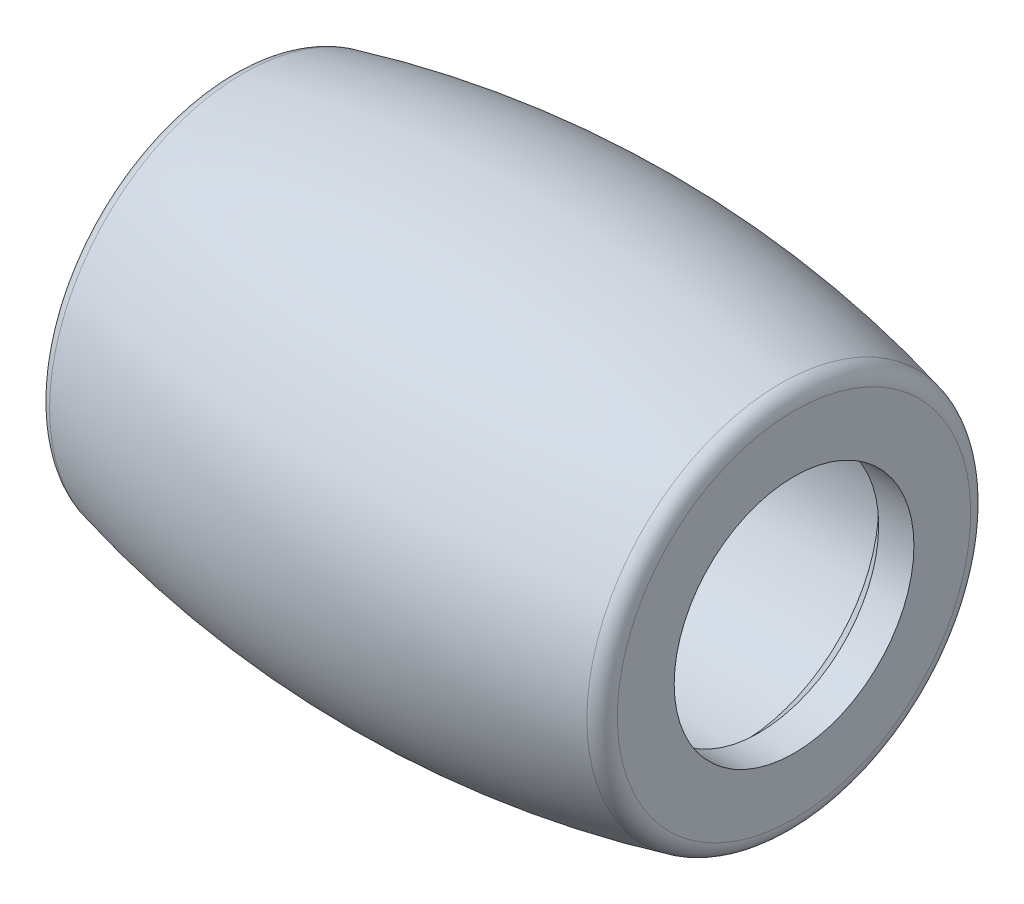
ISO-10303-21;
HEADER;
FILE_DESCRIPTION(('STEP AP214'),'2;1');
FILE_NAME('part.step','',(''),(''),'','','');
FILE_SCHEMA(('AUTOMOTIVE_DESIGN { 1 0 10303 214 1 1 1 1 }'));
ENDSEC;
DATA;
#1=APPLICATION_CONTEXT('core data for automotive mechanical design processes');
#2=APPLICATION_PROTOCOL_DEFINITION('international standard','automotive_design',2000,#1);
#3=PRODUCT_CONTEXT('',#1,'mechanical');
#4=PRODUCT('Part','Part','',(#3));
#5=PRODUCT_RELATED_PRODUCT_CATEGORY('part','',(#4));
#6=PRODUCT_DEFINITION_FORMATION('','',#4);
#7=PRODUCT_DEFINITION_CONTEXT('part definition',#1,'design');
#8=PRODUCT_DEFINITION('design','',#6,#7);
#9=PRODUCT_DEFINITION_SHAPE('','',#8);
#10=(LENGTH_UNIT() NAMED_UNIT(*) SI_UNIT(.MILLI.,.METRE.));
#11=(NAMED_UNIT(*) PLANE_ANGLE_UNIT() SI_UNIT($,.RADIAN.));
#12=(NAMED_UNIT(*) SI_UNIT($,.STERADIAN.) SOLID_ANGLE_UNIT());
#13=UNCERTAINTY_MEASURE_WITH_UNIT(LENGTH_MEASURE(1.E-05),#10,'distance_accuracy_value','');
#14=(GEOMETRIC_REPRESENTATION_CONTEXT(3) GLOBAL_UNCERTAINTY_ASSIGNED_CONTEXT((#13)) GLOBAL_UNIT_ASSIGNED_CONTEXT((#10,
#11,#12)) REPRESENTATION_CONTEXT('',''));
#15=CARTESIAN_POINT('',(0.,0.,0.));
#16=DIRECTION('',(0.,0.,1.));
#17=DIRECTION('',(1.,0.,0.));
#18=AXIS2_PLACEMENT_3D('',#15,#16,#17);
#19=CARTESIAN_POINT('',(-8.8,0.,0.));
#20=DIRECTION('',(1.,0.,0.));
#21=DIRECTION('',(0.,0.,-1.));
#22=AXIS2_PLACEMENT_3D('',#19,#20,#21);
#23=CYLINDRICAL_SURFACE('',#22,3.9);
#24=CARTESIAN_POINT('',(6.50000000001683,0.,0.));
#25=DIRECTION('',(-1.,0.,0.));
#26=DIRECTION('',(0.,0.,1.));
#27=AXIS2_PLACEMENT_3D('',#24,#25,#26);
#28=CIRCLE('',#27,3.89999999998736);
#29=CARTESIAN_POINT('',(6.50000000001683,0.,3.89999999998736));
#30=VERTEX_POINT('',#29);
#31=EDGE_CURVE('E49',#30,#30,#28,.F.);
#32=ORIENTED_EDGE('',*,*,#31,.T.);
#33=EDGE_LOOP('',(#32));
#34=FACE_BOUND('',#33,.T.);
#35=CARTESIAN_POINT('',(-6.50000000007367,0.,0.));
#36=DIRECTION('',(1.,0.,0.));
#37=DIRECTION('',(0.,0.,-1.));
#38=AXIS2_PLACEMENT_3D('',#35,#36,#37);
#39=CIRCLE('',#38,3.89999999998736);
#40=CARTESIAN_POINT('',(-6.50000000007367,0.,-3.89999999998736));
#41=VERTEX_POINT('',#40);
#42=EDGE_CURVE('E110',#41,#41,#39,.F.);
#43=ORIENTED_EDGE('',*,*,#42,.T.);
#44=EDGE_LOOP('',(#43));
#45=FACE_BOUND('',#44,.T.);
#46=ADVANCED_FACE('F15',(#34,#45),#23,.F.);
#47=CARTESIAN_POINT('',(6.50000000013051,0.,0.));
#48=DIRECTION('',(-1.,0.,0.));
#49=DIRECTION('',(0.,0.,1.));
#50=AXIS2_PLACEMENT_3D('',#47,#48,#49);
#51=CONICAL_SURFACE('',#50,3.89999999987367,0.785398163397448);
#52=CARTESIAN_POINT('',(7.,0.,0.));
#53=DIRECTION('',(1.,0.,0.));
#54=DIRECTION('',(0.,0.,-1.));
#55=AXIS2_PLACEMENT_3D('',#52,#53,#54);
#56=CIRCLE('',#55,3.4);
#57=CARTESIAN_POINT('',(7.,0.,-3.4));
#58=VERTEX_POINT('',#57);
#59=EDGE_CURVE('E107',#58,#58,#56,.T.);
#60=ORIENTED_EDGE('',*,*,#59,.T.);
#61=EDGE_LOOP('',(#60));
#62=FACE_BOUND('',#61,.T.);
#63=ORIENTED_EDGE('',*,*,#31,.F.);
#64=EDGE_LOOP('',(#63));
#65=FACE_BOUND('',#64,.T.);
#66=ADVANCED_FACE('F95',(#62,#65),#51,.F.);
#67=CARTESIAN_POINT('',(-6.50000000013051,0.,0.));
#68=DIRECTION('',(1.,0.,0.));
#69=DIRECTION('',(0.,0.,-1.));
#70=AXIS2_PLACEMENT_3D('',#67,#68,#69);
#71=CONICAL_SURFACE('',#70,3.89999999987367,0.785398163340605);
#72=ORIENTED_EDGE('',*,*,#42,.F.);
#73=EDGE_LOOP('',(#72));
#74=FACE_BOUND('',#73,.T.);
#75=CARTESIAN_POINT('',(-7.,0.,0.));
#76=DIRECTION('',(1.,0.,0.));
#77=DIRECTION('',(0.,0.,-1.));
#78=AXIS2_PLACEMENT_3D('',#75,#76,#77);
#79=CIRCLE('',#78,3.4);
#80=CARTESIAN_POINT('',(-7.,0.,-3.4));
#81=VERTEX_POINT('',#80);
#82=EDGE_CURVE('E114',#81,#81,#79,.F.);
#83=ORIENTED_EDGE('',*,*,#82,.T.);
#84=EDGE_LOOP('',(#83));
#85=FACE_BOUND('',#84,.T.);
#86=ADVANCED_FACE('F89',(#74,#85),#71,.F.);
#87=CARTESIAN_POINT('',(-8.8,0.,0.));
#88=DIRECTION('',(1.,0.,0.));
#89=DIRECTION('',(0.,0.,-1.));
#90=AXIS2_PLACEMENT_3D('',#87,#88,#89);
#91=CYLINDRICAL_SURFACE('',#90,3.4);
#92=ORIENTED_EDGE('',*,*,#59,.F.);
#93=EDGE_LOOP('',(#92));
#94=FACE_BOUND('',#93,.T.);
#95=CARTESIAN_POINT('',(8.,0.,0.));
#96=DIRECTION('',(1.,0.,0.));
#97=DIRECTION('',(0.,0.,-1.));
#98=AXIS2_PLACEMENT_3D('',#95,#96,#97);
#99=CIRCLE('',#98,3.4);
#100=CARTESIAN_POINT('',(8.,0.,-3.4));
#101=VERTEX_POINT('',#100);
#102=EDGE_CURVE('E19',#101,#101,#99,.F.);
#103=ORIENTED_EDGE('',*,*,#102,.F.);
#104=EDGE_LOOP('',(#103));
#105=FACE_BOUND('',#104,.T.);
#106=ADVANCED_FACE('F81',(#94,#105),#91,.F.);
#107=CARTESIAN_POINT('',(-8.8,0.,0.));
#108=DIRECTION('',(1.,0.,0.));
#109=DIRECTION('',(0.,0.,-1.));
#110=AXIS2_PLACEMENT_3D('',#107,#108,#109);
#111=CYLINDRICAL_SURFACE('',#110,3.4);
#112=ORIENTED_EDGE('',*,*,#82,.F.);
#113=EDGE_LOOP('',(#112));
#114=FACE_BOUND('',#113,.T.);
#115=CARTESIAN_POINT('',(-8.,0.,0.));
#116=DIRECTION('',(1.,0.,0.));
#117=DIRECTION('',(0.,0.,-1.));
#118=AXIS2_PLACEMENT_3D('',#115,#116,#117);
#119=CIRCLE('',#118,3.4);
#120=CARTESIAN_POINT('',(-8.,0.,-3.4));
#121=VERTEX_POINT('',#120);
#122=EDGE_CURVE('E37',#121,#121,#119,.F.);
#123=ORIENTED_EDGE('',*,*,#122,.T.);
#124=EDGE_LOOP('',(#123));
#125=FACE_BOUND('',#124,.T.);
#126=ADVANCED_FACE('F79',(#114,#125),#111,.F.);
#127=CARTESIAN_POINT('',(8.,0.,0.));
#128=DIRECTION('',(1.,0.,0.));
#129=DIRECTION('',(0.,0.,-1.));
#130=AXIS2_PLACEMENT_3D('',#127,#128,#129);
#131=PLANE('',#130);
#132=CARTESIAN_POINT('',(8.,0.,0.));
#133=DIRECTION('',(1.,0.,0.));
#134=DIRECTION('',(0.,0.,-1.));
#135=AXIS2_PLACEMENT_3D('',#132,#133,#134);
#136=CIRCLE('',#135,5.01062578985514);
#137=CARTESIAN_POINT('',(8.,5.01062578985514,0.));
#138=VERTEX_POINT('',#137);
#139=CARTESIAN_POINT('',(8.,-5.01062578985514,0.));
#140=VERTEX_POINT('',#139);
#141=EDGE_CURVE('E31',#138,#140,#136,.F.);
#142=ORIENTED_EDGE('',*,*,#141,.F.);
#143=CARTESIAN_POINT('',(8.,-5.01062578985514,0.));
#144=CARTESIAN_POINT('',(7.9999999999962,-5.01061017239806,0.0819858376119487));
#145=CARTESIAN_POINT('',(7.9999999990962,-5.00857945970388,0.163971102829677));
#146=CARTESIAN_POINT('',(7.99999999581538,-5.00050036405062,0.327742658121287));
#147=CARTESIAN_POINT('',(7.99999999343457,-4.99445202024229,0.409528950126316));
#148=CARTESIAN_POINT('',(7.9999999875037,-4.97835025500222,0.572705592101634));
#149=CARTESIAN_POINT('',(7.99999998395365,-4.96829686999733,0.654095945666267));
#150=CARTESIAN_POINT('',(7.99999997596904,-4.94420984308057,0.816284826627117));
#151=CARTESIAN_POINT('',(7.99999997153448,-4.93017623478457,0.89708335901578));
#152=CARTESIAN_POINT('',(7.99999996204592,-4.89816246259771,1.05789410703409));
#153=CARTESIAN_POINT('',(7.99999995699192,-4.8801823294746,1.13790632878887));
#154=CARTESIAN_POINT('',(7.99999994650797,-4.84031888923823,1.29695186904908));
#155=CARTESIAN_POINT('',(7.99999994107801,-4.81843561001908,1.37598519454596));
#156=CARTESIAN_POINT('',(7.99999993006455,-4.77081859898757,1.53288271144612));
#157=CARTESIAN_POINT('',(7.99999992448104,-4.74508489219124,1.61074691044155));
#158=CARTESIAN_POINT('',(7.99999991336168,-4.68982902352809,1.76511875960168));
#159=CARTESIAN_POINT('',(7.99999990782583,-4.66030688381338,1.84162641769551));
#160=CARTESIAN_POINT('',(7.99999989698181,-4.59754525681443,1.99310103620146));
#161=CARTESIAN_POINT('',(7.99999989167364,-4.56430578885151,2.06806800461914));
#162=CARTESIAN_POINT('',(7.99999988144382,-4.4941895562832,2.21628080377957));
#163=CARTESIAN_POINT('',(7.99999987652218,-4.45731280822,2.28952664234808));
#164=CARTESIAN_POINT('',(7.9999998672031,-4.38001081600382,2.4341208844473));
#165=CARTESIAN_POINT('',(7.99999986280566,-4.33958558568373,2.50546929537328));
#166=CARTESIAN_POINT('',(7.99999985465146,-4.25528396584897,2.64609695134252));
#167=CARTESIAN_POINT('',(7.99999985089471,-4.21140758754551,2.71537620310654));
#168=CARTESIAN_POINT('',(7.99999984411719,-4.12030931077237,2.85169878931403));
#169=CARTESIAN_POINT('',(7.99999984109643,-4.07308742099712,2.9187421295676));
#170=CARTESIAN_POINT('',(7.99999983586504,-3.97541180839336,3.05043152164811));
#171=CARTESIAN_POINT('',(7.9999998336544,-3.92495809186406,3.11507757814724));
#172=CARTESIAN_POINT('',(7.99999983009621,-3.82094028753171,3.241816799935));
#173=CARTESIAN_POINT('',(7.99999982874865,-3.76737620377028,3.30390996854068));
#174=CARTESIAN_POINT('',(7.99999982694837,-3.65726660932676,3.425393954206));
#175=CARTESIAN_POINT('',(7.99999982649565,-3.60072110058171,3.48478477302132));
#176=CARTESIAN_POINT('',(7.99999982649565,-3.48478477302133,3.6007211005817));
#177=CARTESIAN_POINT('',(7.99999982694837,-3.42539395420602,3.65726660932676));
#178=CARTESIAN_POINT('',(7.99999982874865,-3.30390996854069,3.76737620377026));
#179=CARTESIAN_POINT('',(7.99999983009621,-3.24181679993501,3.82094028753168));
#180=CARTESIAN_POINT('',(7.9999998336544,-3.11507757814726,3.92495809186407));
#181=CARTESIAN_POINT('',(7.99999983586504,-3.05043152164812,3.9754118083934));
#182=CARTESIAN_POINT('',(7.99999984109643,-2.91874212956761,4.07308742099706));
#183=CARTESIAN_POINT('',(7.99999984411719,-2.85169878931403,4.12030931077216));
#184=CARTESIAN_POINT('',(7.99999985089471,-2.71537620310657,4.2114075875457));
#185=CARTESIAN_POINT('',(7.99999985465146,-2.64609695134257,4.25528396584968));
#186=CARTESIAN_POINT('',(7.99999986280566,-2.50546929537325,4.339585585683));
#187=CARTESIAN_POINT('',(7.9999998672031,-2.43412088444716,4.38001081600109));
#188=CARTESIAN_POINT('',(7.99999987652218,-2.28952664234824,4.45731280822271));
#189=CARTESIAN_POINT('',(7.99999988144382,-2.21628080378016,4.49418955629334));
#190=CARTESIAN_POINT('',(7.99999989167364,-2.06806800461859,4.56430578884136));
#191=CARTESIAN_POINT('',(7.99999989698181,-1.99310103619935,4.59754525677656));
#192=CARTESIAN_POINT('',(7.99999990782583,-1.84162641769766,4.66030688385123));
#193=CARTESIAN_POINT('',(7.99999991336168,-1.76511875960965,4.68982902366937));
#194=CARTESIAN_POINT('',(7.99999992448104,-1.61074691043361,4.74508489204995));
#195=CARTESIAN_POINT('',(7.99999993006455,-1.53288271141646,4.77081859846027));
#196=CARTESIAN_POINT('',(7.99999994107801,-1.37598519457565,4.81843561054637));
#197=CARTESIAN_POINT('',(7.99999994650796,-1.29695186915986,4.84031889120612));
#198=CARTESIAN_POINT('',(7.99999995699193,-1.13790632867812,4.88018232750669));
#199=CARTESIAN_POINT('',(7.99999996204594,-1.05789410662072,4.89816245525334));
#200=CARTESIAN_POINT('',(7.99999997153446,-0.897083359429187,4.93017624212898));
#201=CARTESIAN_POINT('',(7.99999997596897,-0.816284828169935,4.94420987049042));
#202=CARTESIAN_POINT('',(7.99999998395372,-0.654095944123466,4.96829684258724));
#203=CARTESIAN_POINT('',(7.99999998750397,-0.572705586343757,4.97835015270595));
#204=CARTESIAN_POINT('',(7.9999999934343,-0.409528955884271,4.99445212253948));
#205=CARTESIAN_POINT('',(7.99999999581436,-0.327742679610333,5.00050074583068));
#206=CARTESIAN_POINT('',(7.99999999909722,-0.163971081340452,5.00857907792011));
#207=CARTESIAN_POINT('',(8.,-0.0819857574126385,5.01060874755472));
#208=CARTESIAN_POINT('',(8.,0.0819865827386127,5.01064283232711));
#209=CARTESIAN_POINT('',(7.99999999909721,0.163973598970778,5.00864720694366));
#210=CARTESIAN_POINT('',(7.99999999581435,0.327751657396931,5.000634056252));
#211=CARTESIAN_POINT('',(7.99999999343427,0.409542697674503,4.9946164917737));
#212=CARTESIAN_POINT('',(7.99999998750395,0.572731604457443,4.97857426182923));
#213=CARTESIAN_POINT('',(7.99999998395369,0.654129467382153,4.9685495599395));
#214=CARTESIAN_POINT('',(7.99999997596893,0.816335757845362,4.94451705346691));
#215=CARTESIAN_POINT('',(7.99999997153443,0.89714418040292,4.93050921526531));
#216=CARTESIAN_POINT('',(7.99999996204591,1.05797674862975,4.89854416881341));
#217=CARTESIAN_POINT('',(7.99999995699189,1.13800088818368,4.8805869297937));
#218=CARTESIAN_POINT('',(7.99999994650793,1.29707193710141,4.84076630862387));
#219=CARTESIAN_POINT('',(7.99999994107797,1.37611883948189,4.81890289857753));
#220=CARTESIAN_POINT('',(7.99999993006451,1.53304481529632,4.77132259492369));
#221=CARTESIAN_POINT('',(7.99999992448101,1.61092388114474,4.74560567629814));
#222=CARTESIAN_POINT('',(7.99999991336165,1.76532639959765,4.69038030934133));
#223=CARTESIAN_POINT('',(7.9999999078258,1.84184984427829,4.66087183885604));
#224=CARTESIAN_POINT('',(7.99999989698178,1.9933566038824,4.59813446996874));
#225=CARTESIAN_POINT('',(7.99999989167361,2.06833991080441,4.56490555224369));
#226=CARTESIAN_POINT('',(7.9999998814438,2.21658559154761,4.49480736627884));
#227=CARTESIAN_POINT('',(7.99999987652216,2.28984795754611,4.45793808149539));
#228=CARTESIAN_POINT('',(7.99999986720308,2.43447510270619,4.38064802146875));
#229=CARTESIAN_POINT('',(7.99999986280565,2.50583987447472,4.34022723239147));
#230=CARTESIAN_POINT('',(7.99999985465145,2.64649975346396,4.25593159203564));
#231=CARTESIAN_POINT('',(7.9999998508947,2.7157948539654,4.21205672954496));
#232=CARTESIAN_POINT('',(7.99999984411718,2.8521483041065,4.12095870375561));
#233=CARTESIAN_POINT('',(7.99999984109643,2.91920664793698,4.07373553176189));
#234=CARTESIAN_POINT('',(7.99999983586503,3.05092489313993,3.9760547262803));
#235=CARTESIAN_POINT('',(7.9999998336544,3.11558478984069,3.92559708649284));
#236=CARTESIAN_POINT('',(7.99999983009621,3.24235023420131,3.82156898793994));
#237=CARTESIAN_POINT('',(7.99999982874865,3.30445577854432,3.7679985251327));
#238=CARTESIAN_POINT('',(7.99999982694837,3.42596277294719,3.65787393269357));
#239=CARTESIAN_POINT('',(7.99999982649565,3.48536422125142,3.60131980112462));
#240=CARTESIAN_POINT('',(7.99999982649565,3.60131980112461,3.48536422125144));
#241=CARTESIAN_POINT('',(7.99999982694837,3.65787393269356,3.4259627729472));
#242=CARTESIAN_POINT('',(7.99999982874865,3.76799852513269,3.30445577854434));
#243=CARTESIAN_POINT('',(7.99999983009621,3.82156898793995,3.24235023420132));
#244=CARTESIAN_POINT('',(7.9999998336544,3.92559708649281,3.1155847898407));
#245=CARTESIAN_POINT('',(7.99999983586503,3.97605472628022,3.05092489313994));
#246=CARTESIAN_POINT('',(7.99999984109643,4.07373553176196,2.919206647937));
#247=CARTESIAN_POINT('',(7.99999984411718,4.12095870375589,2.85214830410653));
#248=CARTESIAN_POINT('',(7.9999998508947,4.21205672954467,2.7157948539654));
#249=CARTESIAN_POINT('',(7.99999985465145,4.25593159203458,2.64649975346393));
#250=CARTESIAN_POINT('',(7.99999986280565,4.34022723239252,2.50583987447478));
#251=CARTESIAN_POINT('',(7.99999986720308,4.38064802147266,2.43447510270638));
#252=CARTESIAN_POINT('',(7.99999987652216,4.45793808149146,2.28984795754595));
#253=CARTESIAN_POINT('',(7.9999998814438,4.49480736626421,2.21658559154698));
#254=CARTESIAN_POINT('',(7.99999989167361,4.5649055522583,2.06833991080507));
#255=CARTESIAN_POINT('',(7.99999989698178,4.5981344700233,1.99335660388482));
#256=CARTESIAN_POINT('',(7.9999999078258,4.66087183880147,1.8418498442759));
#257=CARTESIAN_POINT('',(7.99999991336165,4.69038030913768,1.76532639958869));
#258=CARTESIAN_POINT('',(7.99999992448101,4.74560567650179,1.61092388115374));
#259=CARTESIAN_POINT('',(7.99999993006451,4.7713225956837,1.53304481532985));
#260=CARTESIAN_POINT('',(7.99999994107797,4.81890289781751,1.3761188394484));
#261=CARTESIAN_POINT('',(7.99999994650793,4.84076630578746,1.29707193697635));
#262=CARTESIAN_POINT('',(7.99999995699189,4.88058693263008,1.13800088830876));
#263=CARTESIAN_POINT('',(7.99999996204589,4.89854417939891,1.05797674909654));
#264=CARTESIAN_POINT('',(7.99999997153444,4.93050920467988,0.897144179936169));
#265=CARTESIAN_POINT('',(7.99999997596901,4.94451701396172,0.816335756103385));
#266=CARTESIAN_POINT('',(7.99999998395362,4.96854959944435,0.65412946912415));
#267=CARTESIAN_POINT('',(7.99999998750367,4.97857440926273,0.572731610958588));
#268=CARTESIAN_POINT('',(7.99999999343454,4.99461634434154,0.409542691173448));
#269=CARTESIAN_POINT('',(7.99999999581537,5.00063350603015,0.327751633134732));
#270=CARTESIAN_POINT('',(7.99999999909619,5.00864775716015,0.163973623232776));
#271=CARTESIAN_POINT('',(7.99999999999619,5.01064488575306,0.0819866732851335));
#272=CARTESIAN_POINT('',(8.,5.01062578985514,0.));
#273=B_SPLINE_CURVE_WITH_KNOTS('',3,(#143,#144,#145,#146,#147,#148,#149,#150,#151,#152,#153,
#154,#155,#156,#157,#158,#159,#160,#161,#162,#163,#164,#165,#166,#167,#168,#169,#170,#171,#172,
#173,#174,#175,#176,#177,#178,#179,#180,#181,#182,#183,#184,#185,#186,#187,#188,#189,#190,#191,
#192,#193,#194,#195,#196,#197,#198,#199,#200,#201,#202,#203,#204,#205,#206,#207,#208,#209,#210,
#211,#212,#213,#214,#215,#216,#217,#218,#219,#220,#221,#222,#223,#224,#225,#226,#227,#228,#229,
#230,#231,#232,#233,#234,#235,#236,#237,#238,#239,#240,#241,#242,#243,#244,#245,#246,#247,#248,
#249,#250,#251,#252,#253,#254,#255,#256,#257,#258,#259,#260,#261,#262,#263,#264,#265,#266,#267,
#268,#269,#270,#271,#272),.UNSPECIFIED.,.F.,.F.,(4,2,2,2,2,2,2,2,2,2,2,2,2,2,2,2,2,2,2,2,2,2,2,
2,2,2,2,2,2,2,2,2,2,2,2,2,2,2,2,2,2,2,2,2,2,2,2,2,2,2,2,2,2,2,2,2,2,2,2,2,2,2,2,2,4),(0.,
0.245932592407919,0.491862788303,0.73779074745277,0.983716629624796,1.22964059458664,
1.47556280210585,1.72148341194999,1.96740258388662,2.21332047768326,2.45923725310745,
2.70515306992672,2.95106808790856,3.19698246682047,3.44289636642995,3.68880994650447,
3.93472336681152,4.18063678711857,4.42655036719309,4.67246426680257,4.91837864571448,
5.16429366369632,5.41020948051558,5.65612625593978,5.90204414973642,6.14796332167304,
6.39388393151719,6.6398061390364,6.88573010399824,7.13165598617027,7.37758394532004,
7.62351414121512,7.86944673362304,8.11538180176054,8.36131926511987,8.60725896401955,
8.8532007387781,9.09914442971402,9.34508987714582,9.59103692139202,9.83698540277112,
10.0829351616017,10.3288860382022,10.5748378728912,10.8207905059874,11.0667437778091,
11.3126975286752,11.558651598904,11.8046058288142,12.0505600587245,12.2965141289533,
12.5424678798193,12.7884211516411,13.0343737847372,13.2803256194263,13.5262764960268,
13.7722262548573,14.0181747362365,14.2641217804826,14.5100672279144,14.7560109188504,
15.0019526936089,15.2478923925086,15.4938298558679,15.7397649240054),.UNSPECIFIED.);
#274=EDGE_CURVE('E36',#140,#138,#273,.T.);
#275=ORIENTED_EDGE('',*,*,#274,.F.);
#276=EDGE_LOOP('',(#142,#275));
#277=FACE_BOUND('',#276,.T.);
#278=ORIENTED_EDGE('',*,*,#102,.T.);
#279=EDGE_LOOP('',(#278));
#280=FACE_BOUND('',#279,.T.);
#281=ADVANCED_FACE('F38',(#277,#280),#131,.T.);
#282=CARTESIAN_POINT('',(-8.,0.,0.));
#283=DIRECTION('',(1.,0.,0.));
#284=DIRECTION('',(0.,0.,-1.));
#285=AXIS2_PLACEMENT_3D('',#282,#283,#284);
#286=PLANE('',#285);
#287=CARTESIAN_POINT('',(-8.,0.,0.));
#288=DIRECTION('',(1.,0.,0.));
#289=DIRECTION('',(0.,0.,-1.));
#290=AXIS2_PLACEMENT_3D('',#287,#288,#289);
#291=CIRCLE('',#290,5.01062578985514);
#292=CARTESIAN_POINT('',(-8.,0.,-5.01062578985514));
#293=VERTEX_POINT('',#292);
#294=EDGE_CURVE('E40',#293,#293,#291,.T.);
#295=ORIENTED_EDGE('',*,*,#294,.F.);
#296=EDGE_LOOP('',(#295));
#297=FACE_BOUND('',#296,.T.);
#298=ORIENTED_EDGE('',*,*,#122,.F.);
#299=EDGE_LOOP('',(#298));
#300=FACE_BOUND('',#299,.T.);
#301=ADVANCED_FACE('F60',(#297,#300),#286,.F.);
#302=CARTESIAN_POINT('',(7.5,0.,0.));
#303=DIRECTION('',(1.,0.,0.));
#304=DIRECTION('',(0.,0.,-1.));
#305=AXIS2_PLACEMENT_3D('',#302,#303,#304);
#306=TOROIDAL_SURFACE('',#305,5.01062578985514,0.499999999999999);
#307=ORIENTED_EDGE('',*,*,#141,.T.);
#308=ORIENTED_EDGE('',*,*,#274,.T.);
#309=EDGE_LOOP('',(#307,#308));
#310=FACE_BOUND('',#309,.T.);
#311=CARTESIAN_POINT('',(7.61949316155476,0.,0.));
#312=DIRECTION('',(-1.,0.,0.));
#313=DIRECTION('',(0.,1.,0.));
#314=AXIS2_PLACEMENT_3D('',#311,#312,#313);
#315=CIRCLE('',#314,5.49613725660093);
#316=CARTESIAN_POINT('',(7.61949316155476,5.49613725660093,0.));
#317=VERTEX_POINT('',#316);
#318=EDGE_CURVE('E25',#317,#317,#315,.T.);
#319=ORIENTED_EDGE('',*,*,#318,.F.);
#320=EDGE_LOOP('',(#319));
#321=FACE_BOUND('',#320,.T.);
#322=ADVANCED_FACE('F34',(#310,#321),#306,.T.);
#323=CARTESIAN_POINT('',(-7.5,0.,0.));
#324=DIRECTION('',(1.,0.,0.));
#325=DIRECTION('',(0.,0.,-1.));
#326=AXIS2_PLACEMENT_3D('',#323,#324,#325);
#327=TOROIDAL_SURFACE('',#326,5.01062578985514,0.499999999999998);
#328=ORIENTED_EDGE('',*,*,#294,.T.);
#329=EDGE_LOOP('',(#328));
#330=FACE_BOUND('',#329,.T.);
#331=CARTESIAN_POINT('',(-7.61949316155477,0.,0.));
#332=DIRECTION('',(1.,0.,0.));
#333=DIRECTION('',(0.,1.,0.));
#334=AXIS2_PLACEMENT_3D('',#331,#332,#333);
#335=CIRCLE('',#334,5.49613725660093);
#336=CARTESIAN_POINT('',(-7.61949316155477,5.49613725660093,0.));
#337=VERTEX_POINT('',#336);
#338=EDGE_CURVE('E10',#337,#337,#335,.T.);
#339=ORIENTED_EDGE('',*,*,#338,.F.);
#340=EDGE_LOOP('',(#339));
#341=FACE_BOUND('',#340,.T.);
#342=ADVANCED_FACE('F59',(#330,#341),#327,.T.);
#343=CARTESIAN_POINT('',(0.,0.,0.));
#344=DIRECTION('',(1.,0.,0.));
#345=DIRECTION('',(0.,0.,-1.));
#346=AXIS2_PLACEMENT_3D('',#343,#344,#345);
#347=DEGENERATE_TOROIDAL_SURFACE('',#346,25.4625490196076,31.8825490196076,.F.);
#348=ORIENTED_EDGE('',*,*,#318,.T.);
#349=EDGE_LOOP('',(#348));
#350=FACE_BOUND('',#349,.T.);
#351=ORIENTED_EDGE('',*,*,#338,.T.);
#352=EDGE_LOOP('',(#351));
#353=FACE_BOUND('',#352,.T.);
#354=ADVANCED_FACE('F17',(#350,#353),#347,.F.);
#355=CLOSED_SHELL('',(#46,#66,#86,#106,#126,#281,#301,#322,#342,#354));
#356=MANIFOLD_SOLID_BREP('B1',#355);
#357=ADVANCED_BREP_SHAPE_REPRESENTATION('',(#18,#356),#14);
#358=SHAPE_DEFINITION_REPRESENTATION(#9,#357);
ENDSEC;
END-ISO-10303-21;
